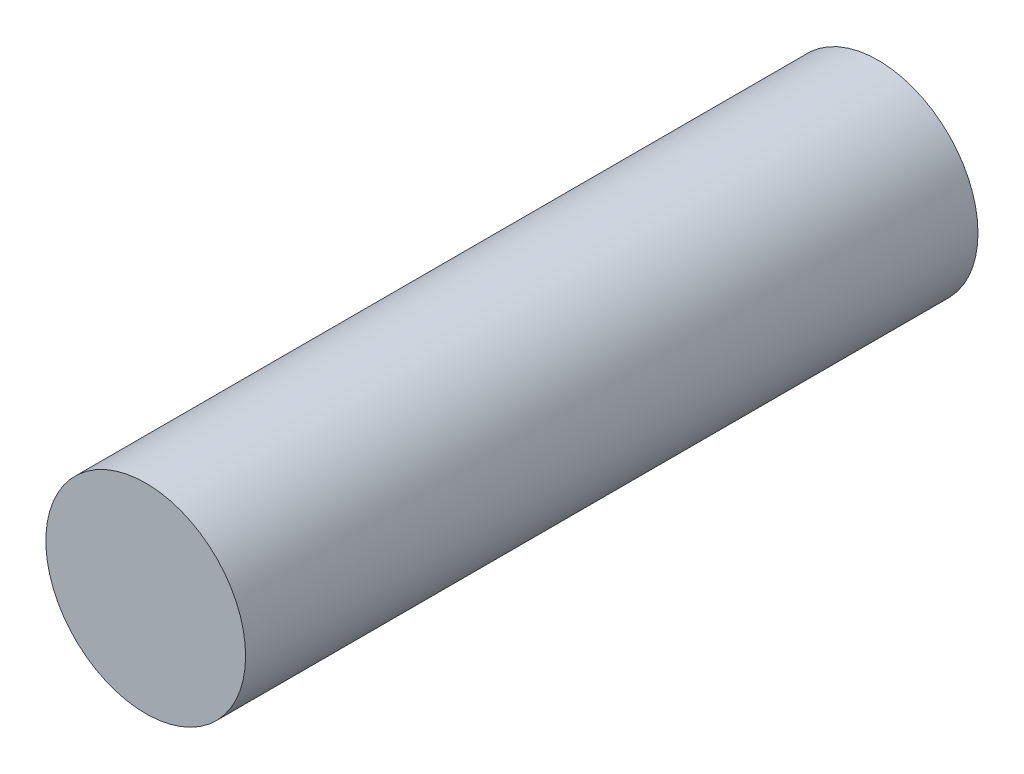
ISO-10303-21;
HEADER;
FILE_DESCRIPTION(('STEP AP214'),'2;1');
FILE_NAME('part.step','',(''),(''),'','','');
FILE_SCHEMA(('AUTOMOTIVE_DESIGN { 1 0 10303 214 1 1 1 1 }'));
ENDSEC;
DATA;
#1=APPLICATION_CONTEXT('core data for automotive mechanical design processes');
#2=APPLICATION_PROTOCOL_DEFINITION('international standard','automotive_design',2000,#1);
#3=PRODUCT_CONTEXT('',#1,'mechanical');
#4=PRODUCT('Part','Part','',(#3));
#5=PRODUCT_RELATED_PRODUCT_CATEGORY('part','',(#4));
#6=PRODUCT_DEFINITION_FORMATION('','',#4);
#7=PRODUCT_DEFINITION_CONTEXT('part definition',#1,'design');
#8=PRODUCT_DEFINITION('design','',#6,#7);
#9=PRODUCT_DEFINITION_SHAPE('','',#8);
#10=(LENGTH_UNIT() NAMED_UNIT(*) SI_UNIT(.MILLI.,.METRE.));
#11=(NAMED_UNIT(*) PLANE_ANGLE_UNIT() SI_UNIT($,.RADIAN.));
#12=(NAMED_UNIT(*) SI_UNIT($,.STERADIAN.) SOLID_ANGLE_UNIT());
#13=UNCERTAINTY_MEASURE_WITH_UNIT(LENGTH_MEASURE(1.E-05),#10,'distance_accuracy_value','');
#14=(GEOMETRIC_REPRESENTATION_CONTEXT(3) GLOBAL_UNCERTAINTY_ASSIGNED_CONTEXT((#13)) GLOBAL_UNIT_ASSIGNED_CONTEXT((#10,
#11,#12)) REPRESENTATION_CONTEXT('',''));
#15=CARTESIAN_POINT('',(0.,0.,0.));
#16=DIRECTION('',(0.,0.,1.));
#17=DIRECTION('',(1.,0.,0.));
#18=AXIS2_PLACEMENT_3D('',#15,#16,#17);
#19=CARTESIAN_POINT('',(0.,0.,11.));
#20=DIRECTION('',(0.,0.,-1.));
#21=DIRECTION('',(-1.,0.,0.));
#22=AXIS2_PLACEMENT_3D('',#19,#20,#21);
#23=CYLINDRICAL_SURFACE('',#22,1.5);
#24=CARTESIAN_POINT('',(0.,0.,11.));
#25=DIRECTION('',(0.,0.,1.));
#26=DIRECTION('',(1.,0.,0.));
#27=AXIS2_PLACEMENT_3D('',#24,#25,#26);
#28=CIRCLE('',#27,1.5);
#29=CARTESIAN_POINT('',(1.5,0.,11.));
#30=VERTEX_POINT('',#29);
#31=EDGE_CURVE('E10',#30,#30,#28,.T.);
#32=ORIENTED_EDGE('',*,*,#31,.F.);
#33=EDGE_LOOP('',(#32));
#34=FACE_BOUND('',#33,.T.);
#35=CARTESIAN_POINT('',(0.,0.,0.));
#36=DIRECTION('',(0.,0.,1.));
#37=DIRECTION('',(1.,0.,0.));
#38=AXIS2_PLACEMENT_3D('',#35,#36,#37);
#39=CIRCLE('',#38,1.5);
#40=CARTESIAN_POINT('',(1.5,0.,0.));
#41=VERTEX_POINT('',#40);
#42=EDGE_CURVE('E40',#41,#41,#39,.T.);
#43=ORIENTED_EDGE('',*,*,#42,.T.);
#44=EDGE_LOOP('',(#43));
#45=FACE_BOUND('',#44,.T.);
#46=ADVANCED_FACE('F37',(#34,#45),#23,.T.);
#47=CARTESIAN_POINT('',(0.,0.,11.));
#48=DIRECTION('',(0.,0.,1.));
#49=DIRECTION('',(1.,0.,0.));
#50=AXIS2_PLACEMENT_3D('',#47,#48,#49);
#51=PLANE('',#50);
#52=ORIENTED_EDGE('',*,*,#31,.T.);
#53=EDGE_LOOP('',(#52));
#54=FACE_BOUND('',#53,.T.);
#55=ADVANCED_FACE('F54',(#54),#51,.T.);
#56=CARTESIAN_POINT('',(0.,0.,0.));
#57=DIRECTION('',(0.,0.,1.));
#58=DIRECTION('',(1.,0.,0.));
#59=AXIS2_PLACEMENT_3D('',#56,#57,#58);
#60=PLANE('',#59);
#61=ORIENTED_EDGE('',*,*,#42,.F.);
#62=EDGE_LOOP('',(#61));
#63=FACE_BOUND('',#62,.T.);
#64=ADVANCED_FACE('F52',(#63),#60,.F.);
#65=CLOSED_SHELL('',(#46,#55,#64));
#66=MANIFOLD_SOLID_BREP('B2',#65);
#67=ADVANCED_BREP_SHAPE_REPRESENTATION('',(#18,#66),#14);
#68=SHAPE_DEFINITION_REPRESENTATION(#9,#67);
ENDSEC;
END-ISO-10303-21;
